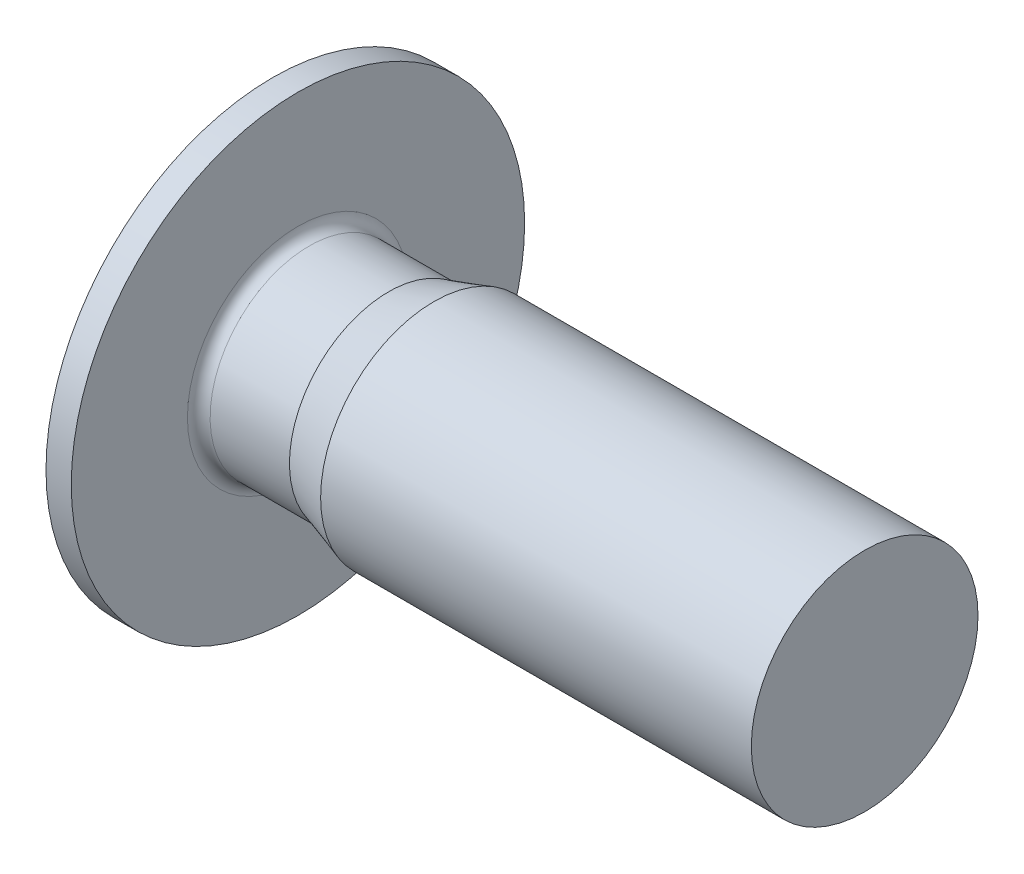
ISO-10303-21;
HEADER;
FILE_DESCRIPTION(('STEP AP214'),'2;1');
FILE_NAME('part.step','',(''),(''),'','','');
FILE_SCHEMA(('AUTOMOTIVE_DESIGN { 1 0 10303 214 1 1 1 1 }'));
ENDSEC;
DATA;
#1=APPLICATION_CONTEXT('core data for automotive mechanical design processes');
#2=APPLICATION_PROTOCOL_DEFINITION('international standard','automotive_design',2000,#1);
#3=PRODUCT_CONTEXT('',#1,'mechanical');
#4=PRODUCT('Part','Part','',(#3));
#5=PRODUCT_RELATED_PRODUCT_CATEGORY('part','',(#4));
#6=PRODUCT_DEFINITION_FORMATION('','',#4);
#7=PRODUCT_DEFINITION_CONTEXT('part definition',#1,'design');
#8=PRODUCT_DEFINITION('design','',#6,#7);
#9=PRODUCT_DEFINITION_SHAPE('','',#8);
#10=(LENGTH_UNIT() NAMED_UNIT(*) SI_UNIT(.MILLI.,.METRE.));
#11=(NAMED_UNIT(*) PLANE_ANGLE_UNIT() SI_UNIT($,.RADIAN.));
#12=(NAMED_UNIT(*) SI_UNIT($,.STERADIAN.) SOLID_ANGLE_UNIT());
#13=UNCERTAINTY_MEASURE_WITH_UNIT(LENGTH_MEASURE(1.E-05),#10,'distance_accuracy_value','');
#14=(GEOMETRIC_REPRESENTATION_CONTEXT(3) GLOBAL_UNCERTAINTY_ASSIGNED_CONTEXT((#13)) GLOBAL_UNIT_ASSIGNED_CONTEXT((#10,
#11,#12)) REPRESENTATION_CONTEXT('',''));
#15=CARTESIAN_POINT('',(0.,0.,0.));
#16=DIRECTION('',(0.,0.,1.));
#17=DIRECTION('',(1.,0.,0.));
#18=AXIS2_PLACEMENT_3D('',#15,#16,#17);
#19=CARTESIAN_POINT('',(0.7,0.,0.));
#20=DIRECTION('',(-1.,0.,0.));
#21=DIRECTION('',(0.,0.,1.));
#22=AXIS2_PLACEMENT_3D('',#19,#20,#21);
#23=PLANE('',#22);
#24=CARTESIAN_POINT('',(0.7,0.,0.));
#25=DIRECTION('',(-1.,0.,0.));
#26=DIRECTION('',(0.,-1.,0.));
#27=AXIS2_PLACEMENT_3D('',#24,#25,#26);
#28=CIRCLE('',#27,0.65);
#29=CARTESIAN_POINT('',(0.7,-0.562916512459885,0.325));
#30=VERTEX_POINT('',#29);
#31=CARTESIAN_POINT('',(0.7,0.,0.65));
#32=VERTEX_POINT('',#31);
#33=EDGE_CURVE('E55',#30,#32,#28,.T.);
#34=ORIENTED_EDGE('',*,*,#33,.F.);
#35=DIRECTION('',(0.,0.5,0.866025403784439));
#36=VECTOR('',#35,1.);
#37=CARTESIAN_POINT('',(0.7,-0.750555349946514,0.));
#38=LINE('',#37,#36);
#39=CARTESIAN_POINT('',(0.7,-0.375277674973257,0.65));
#40=VERTEX_POINT('',#39);
#41=EDGE_CURVE('E270',#30,#40,#38,.T.);
#42=ORIENTED_EDGE('',*,*,#41,.T.);
#43=DIRECTION('',(0.,1.,0.));
#44=VECTOR('',#43,1.);
#45=CARTESIAN_POINT('',(0.7,-0.375277674973257,0.65));
#46=LINE('',#45,#44);
#47=EDGE_CURVE('E238',#40,#32,#46,.T.);
#48=ORIENTED_EDGE('',*,*,#47,.T.);
#49=EDGE_LOOP('',(#34,#42,#48));
#50=FACE_BOUND('',#49,.T.);
#51=ADVANCED_FACE('F44',(#50),#23,.T.);
#52=CARTESIAN_POINT('',(0.7,0.562916512459885,0.325));
#53=VERTEX_POINT('',#52);
#54=EDGE_CURVE('E11',#32,#53,#28,.T.);
#55=ORIENTED_EDGE('',*,*,#54,.F.);
#56=CARTESIAN_POINT('',(0.7,0.375277674973257,0.65));
#57=VERTEX_POINT('',#56);
#58=EDGE_CURVE('E263',#32,#57,#46,.T.);
#59=ORIENTED_EDGE('',*,*,#58,.T.);
#60=DIRECTION('',(0.,0.5,-0.866025403784438));
#61=VECTOR('',#60,1.);
#62=CARTESIAN_POINT('',(0.7,0.375277674973257,0.65));
#63=LINE('',#62,#61);
#64=EDGE_CURVE('E284',#57,#53,#63,.T.);
#65=ORIENTED_EDGE('',*,*,#64,.T.);
#66=EDGE_LOOP('',(#55,#59,#65));
#67=FACE_BOUND('',#66,.T.);
#68=ADVANCED_FACE('F131',(#67),#23,.T.);
#69=CARTESIAN_POINT('',(0.7,0.562916512459885,-0.325));
#70=VERTEX_POINT('',#69);
#71=EDGE_CURVE('E53',#53,#70,#28,.T.);
#72=ORIENTED_EDGE('',*,*,#71,.F.);
#73=CARTESIAN_POINT('',(0.7,0.750555349946514,0.));
#74=VERTEX_POINT('',#73);
#75=EDGE_CURVE('E251',#53,#74,#63,.T.);
#76=ORIENTED_EDGE('',*,*,#75,.T.);
#77=DIRECTION('',(0.,-0.5,-0.866025403784439));
#78=VECTOR('',#77,1.);
#79=CARTESIAN_POINT('',(0.7,0.750555349946514,0.));
#80=LINE('',#79,#78);
#81=EDGE_CURVE('E281',#74,#70,#80,.T.);
#82=ORIENTED_EDGE('',*,*,#81,.T.);
#83=EDGE_LOOP('',(#72,#76,#82));
#84=FACE_BOUND('',#83,.T.);
#85=ADVANCED_FACE('F136',(#84),#23,.T.);
#86=CARTESIAN_POINT('',(0.7,0.,-0.65));
#87=VERTEX_POINT('',#86);
#88=EDGE_CURVE('E229',#70,#87,#28,.T.);
#89=ORIENTED_EDGE('',*,*,#88,.F.);
#90=CARTESIAN_POINT('',(0.7,0.375277674973257,-0.65));
#91=VERTEX_POINT('',#90);
#92=EDGE_CURVE('E283',#70,#91,#80,.T.);
#93=ORIENTED_EDGE('',*,*,#92,.T.);
#94=DIRECTION('',(0.,-1.,0.));
#95=VECTOR('',#94,1.);
#96=CARTESIAN_POINT('',(0.7,0.375277674973257,-0.65));
#97=LINE('',#96,#95);
#98=EDGE_CURVE('E277',#91,#87,#97,.T.);
#99=ORIENTED_EDGE('',*,*,#98,.T.);
#100=EDGE_LOOP('',(#89,#93,#99));
#101=FACE_BOUND('',#100,.T.);
#102=ADVANCED_FACE('F195',(#101),#23,.T.);
#103=CARTESIAN_POINT('',(0.7,-0.562916512459885,-0.325));
#104=VERTEX_POINT('',#103);
#105=EDGE_CURVE('E62',#87,#104,#28,.T.);
#106=ORIENTED_EDGE('',*,*,#105,.F.);
#107=CARTESIAN_POINT('',(0.7,-0.375277674973257,-0.65));
#108=VERTEX_POINT('',#107);
#109=EDGE_CURVE('E280',#87,#108,#97,.T.);
#110=ORIENTED_EDGE('',*,*,#109,.T.);
#111=DIRECTION('',(0.,-0.5,0.866025403784439));
#112=VECTOR('',#111,1.);
#113=CARTESIAN_POINT('',(0.7,-0.375277674973257,-0.65));
#114=LINE('',#113,#112);
#115=EDGE_CURVE('E272',#108,#104,#114,.T.);
#116=ORIENTED_EDGE('',*,*,#115,.T.);
#117=EDGE_LOOP('',(#106,#110,#116));
#118=FACE_BOUND('',#117,.T.);
#119=ADVANCED_FACE('F129',(#118),#23,.T.);
#120=CARTESIAN_POINT('',(-0.5,0.,0.));
#121=DIRECTION('',(-1.,0.,0.));
#122=DIRECTION('',(0.,-1.,0.));
#123=AXIS2_PLACEMENT_3D('',#120,#121,#122);
#124=CYLINDRICAL_SURFACE('',#123,0.875);
#125=CARTESIAN_POINT('',(0.1,0.,0.));
#126=DIRECTION('',(-1.,0.,0.));
#127=DIRECTION('',(0.,-1.,0.));
#128=AXIS2_PLACEMENT_3D('',#125,#126,#127);
#129=CIRCLE('',#128,0.875);
#130=CARTESIAN_POINT('',(0.1,-0.875,0.));
#131=VERTEX_POINT('',#130);
#132=EDGE_CURVE('E48',#131,#131,#129,.F.);
#133=ORIENTED_EDGE('',*,*,#132,.T.);
#134=EDGE_LOOP('',(#133));
#135=FACE_BOUND('',#134,.T.);
#136=CARTESIAN_POINT('',(0.8,0.,0.));
#137=DIRECTION('',(-1.,0.,0.));
#138=DIRECTION('',(0.,-1.,0.));
#139=AXIS2_PLACEMENT_3D('',#136,#137,#138);
#140=CIRCLE('',#139,0.875);
#141=CARTESIAN_POINT('',(0.8,-0.875,0.));
#142=VERTEX_POINT('',#141);
#143=EDGE_CURVE('E202',#142,#142,#140,.T.);
#144=ORIENTED_EDGE('',*,*,#143,.T.);
#145=EDGE_LOOP('',(#144));
#146=FACE_BOUND('',#145,.T.);
#147=ADVANCED_FACE('F188',(#135,#146),#124,.T.);
#148=CARTESIAN_POINT('',(0.,2.,0.));
#149=DIRECTION('',(-1.,0.,0.));
#150=DIRECTION('',(0.,-1.,0.));
#151=AXIS2_PLACEMENT_3D('',#148,#149,#150);
#152=PLANE('',#151);
#153=CARTESIAN_POINT('',(0.,0.,0.));
#154=DIRECTION('',(-1.,0.,0.));
#155=DIRECTION('',(0.,-1.,0.));
#156=AXIS2_PLACEMENT_3D('',#153,#154,#155);
#157=CIRCLE('',#156,0.975);
#158=CARTESIAN_POINT('',(0.,-0.975,0.));
#159=VERTEX_POINT('',#158);
#160=EDGE_CURVE('E225',#159,#159,#157,.T.);
#161=ORIENTED_EDGE('',*,*,#160,.T.);
#162=EDGE_LOOP('',(#161));
#163=FACE_BOUND('',#162,.T.);
#164=CARTESIAN_POINT('',(0.,0.,0.));
#165=DIRECTION('',(-1.,0.,0.));
#166=DIRECTION('',(0.,-1.,0.));
#167=AXIS2_PLACEMENT_3D('',#164,#165,#166);
#168=CIRCLE('',#167,2.);
#169=CARTESIAN_POINT('',(0.,-2.,0.));
#170=VERTEX_POINT('',#169);
#171=EDGE_CURVE('E223',#170,#170,#168,.T.);
#172=ORIENTED_EDGE('',*,*,#171,.F.);
#173=EDGE_LOOP('',(#172));
#174=FACE_BOUND('',#173,.T.);
#175=ADVANCED_FACE('F185',(#163,#174),#152,.F.);
#176=CARTESIAN_POINT('',(-0.5,0.,0.));
#177=DIRECTION('',(-1.,0.,0.));
#178=DIRECTION('',(0.,-1.,0.));
#179=AXIS2_PLACEMENT_3D('',#176,#177,#178);
#180=CYLINDRICAL_SURFACE('',#179,2.);
#181=CARTESIAN_POINT('',(-0.222871870788983,0.,0.));
#182=DIRECTION('',(-1.,0.,0.));
#183=DIRECTION('',(0.,-1.,0.));
#184=AXIS2_PLACEMENT_3D('',#181,#182,#183);
#185=CIRCLE('',#184,2.);
#186=CARTESIAN_POINT('',(-0.222871870788983,-2.,0.));
#187=VERTEX_POINT('',#186);
#188=EDGE_CURVE('E220',#187,#187,#185,.T.);
#189=ORIENTED_EDGE('',*,*,#188,.F.);
#190=EDGE_LOOP('',(#189));
#191=FACE_BOUND('',#190,.T.);
#192=ORIENTED_EDGE('',*,*,#171,.T.);
#193=EDGE_LOOP('',(#192));
#194=FACE_BOUND('',#193,.T.);
#195=ADVANCED_FACE('F181',(#191,#194),#180,.T.);
#196=CARTESIAN_POINT('',(-0.222871870788983,0.,0.));
#197=DIRECTION('',(1.,0.,0.));
#198=DIRECTION('',(0.,1.,0.));
#199=AXIS2_PLACEMENT_3D('',#196,#197,#198);
#200=CONICAL_SURFACE('',#199,2.,1.0471975511966);
#201=CARTESIAN_POINT('',(-0.5,0.,0.));
#202=DIRECTION('',(-1.,0.,0.));
#203=DIRECTION('',(0.,-1.,0.));
#204=AXIS2_PLACEMENT_3D('',#201,#202,#203);
#205=CIRCLE('',#204,1.52);
#206=CARTESIAN_POINT('',(-0.5,-1.52,0.));
#207=VERTEX_POINT('',#206);
#208=EDGE_CURVE('E217',#207,#207,#205,.T.);
#209=ORIENTED_EDGE('',*,*,#208,.F.);
#210=EDGE_LOOP('',(#209));
#211=FACE_BOUND('',#210,.T.);
#212=ORIENTED_EDGE('',*,*,#188,.T.);
#213=EDGE_LOOP('',(#212));
#214=FACE_BOUND('',#213,.T.);
#215=ADVANCED_FACE('F177',(#211,#214),#200,.T.);
#216=CARTESIAN_POINT('',(-0.5,0.,0.));
#217=DIRECTION('',(1.,0.,0.));
#218=DIRECTION('',(0.,1.,0.));
#219=AXIS2_PLACEMENT_3D('',#216,#217,#218);
#220=PLANE('',#219);
#221=DIRECTION('',(0.,-0.5,-0.866025403784439));
#222=VECTOR('',#221,1.);
#223=CARTESIAN_POINT('',(-0.5,0.750555349946514,0.));
#224=LINE('',#223,#222);
#225=CARTESIAN_POINT('',(-0.5,0.750555349946514,0.));
#226=VERTEX_POINT('',#225);
#227=CARTESIAN_POINT('',(-0.5,0.375277674973257,-0.65));
#228=VERTEX_POINT('',#227);
#229=EDGE_CURVE('E232',#226,#228,#224,.T.);
#230=ORIENTED_EDGE('',*,*,#229,.F.);
#231=DIRECTION('',(0.,0.5,-0.866025403784438));
#232=VECTOR('',#231,1.);
#233=CARTESIAN_POINT('',(-0.5,0.375277674973257,0.65));
#234=LINE('',#233,#232);
#235=CARTESIAN_POINT('',(-0.5,0.375277674973257,0.65));
#236=VERTEX_POINT('',#235);
#237=EDGE_CURVE('E70',#236,#226,#234,.T.);
#238=ORIENTED_EDGE('',*,*,#237,.F.);
#239=DIRECTION('',(0.,1.,0.));
#240=VECTOR('',#239,1.);
#241=CARTESIAN_POINT('',(-0.5,-0.375277674973257,0.65));
#242=LINE('',#241,#240);
#243=CARTESIAN_POINT('',(-0.5,-0.375277674973257,0.65));
#244=VERTEX_POINT('',#243);
#245=EDGE_CURVE('E249',#244,#236,#242,.T.);
#246=ORIENTED_EDGE('',*,*,#245,.F.);
#247=DIRECTION('',(0.,0.5,0.866025403784439));
#248=VECTOR('',#247,1.);
#249=CARTESIAN_POINT('',(-0.5,-0.750555349946514,0.));
#250=LINE('',#249,#248);
#251=CARTESIAN_POINT('',(-0.5,-0.750555349946514,0.));
#252=VERTEX_POINT('',#251);
#253=EDGE_CURVE('E246',#252,#244,#250,.T.);
#254=ORIENTED_EDGE('',*,*,#253,.F.);
#255=DIRECTION('',(0.,-0.5,0.866025403784439));
#256=VECTOR('',#255,1.);
#257=CARTESIAN_POINT('',(-0.5,-0.375277674973257,-0.65));
#258=LINE('',#257,#256);
#259=CARTESIAN_POINT('',(-0.5,-0.375277674973257,-0.65));
#260=VERTEX_POINT('',#259);
#261=EDGE_CURVE('E243',#260,#252,#258,.T.);
#262=ORIENTED_EDGE('',*,*,#261,.F.);
#263=DIRECTION('',(0.,-1.,0.));
#264=VECTOR('',#263,1.);
#265=CARTESIAN_POINT('',(-0.5,0.375277674973257,-0.65));
#266=LINE('',#265,#264);
#267=EDGE_CURVE('E235',#228,#260,#266,.T.);
#268=ORIENTED_EDGE('',*,*,#267,.F.);
#269=EDGE_LOOP('',(#230,#238,#246,#254,#262,#268));
#270=FACE_BOUND('',#269,.T.);
#271=ORIENTED_EDGE('',*,*,#208,.T.);
#272=EDGE_LOOP('',(#271));
#273=FACE_BOUND('',#272,.T.);
#274=ADVANCED_FACE('F173',(#270,#273),#220,.F.);
#275=CARTESIAN_POINT('',(5.,1.,0.));
#276=DIRECTION('',(-1.,0.,0.));
#277=DIRECTION('',(0.,-1.,0.));
#278=AXIS2_PLACEMENT_3D('',#275,#276,#277);
#279=PLANE('',#278);
#280=CARTESIAN_POINT('',(5.,0.,0.));
#281=DIRECTION('',(-1.,0.,0.));
#282=DIRECTION('',(0.,-1.,0.));
#283=AXIS2_PLACEMENT_3D('',#280,#281,#282);
#284=CIRCLE('',#283,1.);
#285=CARTESIAN_POINT('',(5.,-1.,0.));
#286=VERTEX_POINT('',#285);
#287=EDGE_CURVE('E207',#286,#286,#284,.T.);
#288=ORIENTED_EDGE('',*,*,#287,.F.);
#289=EDGE_LOOP('',(#288));
#290=FACE_BOUND('',#289,.T.);
#291=ADVANCED_FACE('F169',(#290),#279,.F.);
#292=CARTESIAN_POINT('',(-0.5,0.,0.));
#293=DIRECTION('',(-1.,0.,0.));
#294=DIRECTION('',(0.,-1.,0.));
#295=AXIS2_PLACEMENT_3D('',#292,#293,#294);
#296=CYLINDRICAL_SURFACE('',#295,1.);
#297=CARTESIAN_POINT('',(1.2,0.,0.));
#298=DIRECTION('',(-1.,0.,0.));
#299=DIRECTION('',(0.,-1.,0.));
#300=AXIS2_PLACEMENT_3D('',#297,#298,#299);
#301=CIRCLE('',#300,1.);
#302=CARTESIAN_POINT('',(1.2,-1.,0.));
#303=VERTEX_POINT('',#302);
#304=EDGE_CURVE('E203',#303,#303,#301,.T.);
#305=ORIENTED_EDGE('',*,*,#304,.F.);
#306=EDGE_LOOP('',(#305));
#307=FACE_BOUND('',#306,.T.);
#308=ORIENTED_EDGE('',*,*,#287,.T.);
#309=EDGE_LOOP('',(#308));
#310=FACE_BOUND('',#309,.T.);
#311=ADVANCED_FACE('F165',(#307,#310),#296,.T.);
#312=CARTESIAN_POINT('',(1.2,0.,0.));
#313=DIRECTION('',(1.,0.,0.));
#314=DIRECTION('',(0.,1.,0.));
#315=AXIS2_PLACEMENT_3D('',#312,#313,#314);
#316=CONICAL_SURFACE('',#315,1.,0.302884868374972);
#317=ORIENTED_EDGE('',*,*,#143,.F.);
#318=EDGE_LOOP('',(#317));
#319=FACE_BOUND('',#318,.T.);
#320=ORIENTED_EDGE('',*,*,#304,.T.);
#321=EDGE_LOOP('',(#320));
#322=FACE_BOUND('',#321,.T.);
#323=ADVANCED_FACE('F162',(#319,#322),#316,.T.);
#324=CARTESIAN_POINT('',(0.1,0.,0.));
#325=DIRECTION('',(-1.,0.,0.));
#326=DIRECTION('',(0.,-1.,0.));
#327=AXIS2_PLACEMENT_3D('',#324,#325,#326);
#328=TOROIDAL_SURFACE('',#327,0.975,0.1);
#329=ORIENTED_EDGE('',*,*,#132,.F.);
#330=EDGE_LOOP('',(#329));
#331=FACE_BOUND('',#330,.T.);
#332=ORIENTED_EDGE('',*,*,#160,.F.);
#333=EDGE_LOOP('',(#332));
#334=FACE_BOUND('',#333,.T.);
#335=ADVANCED_FACE('F46',(#331,#334),#328,.F.);
#336=CARTESIAN_POINT('',(0.7,0.375277674973257,0.65));
#337=DIRECTION('',(0.,0.866025403784439,0.5));
#338=DIRECTION('',(0.,-0.5,0.866025403784439));
#339=AXIS2_PLACEMENT_3D('',#336,#337,#338);
#340=PLANE('',#339);
#341=ORIENTED_EDGE('',*,*,#237,.T.);
#342=DIRECTION('',(-1.,0.,0.));
#343=VECTOR('',#342,1.);
#344=CARTESIAN_POINT('',(0.7,0.750555349946514,0.));
#345=LINE('',#344,#343);
#346=EDGE_CURVE('E212',#74,#226,#345,.T.);
#347=ORIENTED_EDGE('',*,*,#346,.F.);
#348=ORIENTED_EDGE('',*,*,#75,.F.);
#349=ORIENTED_EDGE('',*,*,#64,.F.);
#350=DIRECTION('',(-1.,0.,0.));
#351=VECTOR('',#350,1.);
#352=CARTESIAN_POINT('',(0.7,0.375277674973257,0.65));
#353=LINE('',#352,#351);
#354=EDGE_CURVE('E204',#57,#236,#353,.T.);
#355=ORIENTED_EDGE('',*,*,#354,.T.);
#356=EDGE_LOOP('',(#341,#347,#348,#349,#355));
#357=FACE_BOUND('',#356,.T.);
#358=ADVANCED_FACE('F144',(#357),#340,.F.);
#359=CARTESIAN_POINT('',(0.7,-0.375277674973257,0.65));
#360=DIRECTION('',(0.,0.,1.));
#361=DIRECTION('',(1.,0.,0.));
#362=AXIS2_PLACEMENT_3D('',#359,#360,#361);
#363=PLANE('',#362);
#364=ORIENTED_EDGE('',*,*,#245,.T.);
#365=ORIENTED_EDGE('',*,*,#354,.F.);
#366=ORIENTED_EDGE('',*,*,#58,.F.);
#367=ORIENTED_EDGE('',*,*,#47,.F.);
#368=DIRECTION('',(-1.,0.,0.));
#369=VECTOR('',#368,1.);
#370=CARTESIAN_POINT('',(0.7,-0.375277674973257,0.65));
#371=LINE('',#370,#369);
#372=EDGE_CURVE('E209',#40,#244,#371,.T.);
#373=ORIENTED_EDGE('',*,*,#372,.T.);
#374=EDGE_LOOP('',(#364,#365,#366,#367,#373));
#375=FACE_BOUND('',#374,.T.);
#376=ADVANCED_FACE('F140',(#375),#363,.F.);
#377=CARTESIAN_POINT('',(0.7,-0.750555349946514,0.));
#378=DIRECTION('',(0.,-0.866025403784439,0.5));
#379=DIRECTION('',(0.,-0.5,-0.866025403784439));
#380=AXIS2_PLACEMENT_3D('',#377,#378,#379);
#381=PLANE('',#380);
#382=ORIENTED_EDGE('',*,*,#253,.T.);
#383=ORIENTED_EDGE('',*,*,#372,.F.);
#384=ORIENTED_EDGE('',*,*,#41,.F.);
#385=CARTESIAN_POINT('',(0.7,-0.750555349946514,0.));
#386=VERTEX_POINT('',#385);
#387=EDGE_CURVE('E265',#386,#30,#38,.T.);
#388=ORIENTED_EDGE('',*,*,#387,.F.);
#389=DIRECTION('',(-1.,0.,0.));
#390=VECTOR('',#389,1.);
#391=CARTESIAN_POINT('',(0.7,-0.750555349946514,0.));
#392=LINE('',#391,#390);
#393=EDGE_CURVE('E254',#386,#252,#392,.T.);
#394=ORIENTED_EDGE('',*,*,#393,.T.);
#395=EDGE_LOOP('',(#382,#383,#384,#388,#394));
#396=FACE_BOUND('',#395,.T.);
#397=ADVANCED_FACE('F143',(#396),#381,.F.);
#398=CARTESIAN_POINT('',(0.7,-0.375277674973257,-0.65));
#399=DIRECTION('',(0.,-0.866025403784439,-0.5));
#400=DIRECTION('',(0.,0.5,-0.866025403784439));
#401=AXIS2_PLACEMENT_3D('',#398,#399,#400);
#402=PLANE('',#401);
#403=ORIENTED_EDGE('',*,*,#261,.T.);
#404=ORIENTED_EDGE('',*,*,#393,.F.);
#405=EDGE_CURVE('E276',#104,#386,#114,.T.);
#406=ORIENTED_EDGE('',*,*,#405,.F.);
#407=ORIENTED_EDGE('',*,*,#115,.F.);
#408=DIRECTION('',(-1.,0.,0.));
#409=VECTOR('',#408,1.);
#410=CARTESIAN_POINT('',(0.7,-0.375277674973257,-0.65));
#411=LINE('',#410,#409);
#412=EDGE_CURVE('E256',#108,#260,#411,.T.);
#413=ORIENTED_EDGE('',*,*,#412,.T.);
#414=EDGE_LOOP('',(#403,#404,#406,#407,#413));
#415=FACE_BOUND('',#414,.T.);
#416=ADVANCED_FACE('F148',(#415),#402,.F.);
#417=CARTESIAN_POINT('',(0.7,0.375277674973257,-0.65));
#418=DIRECTION('',(0.,0.,-1.));
#419=DIRECTION('',(0.,1.,0.));
#420=AXIS2_PLACEMENT_3D('',#417,#418,#419);
#421=PLANE('',#420);
#422=ORIENTED_EDGE('',*,*,#267,.T.);
#423=ORIENTED_EDGE('',*,*,#412,.F.);
#424=ORIENTED_EDGE('',*,*,#109,.F.);
#425=ORIENTED_EDGE('',*,*,#98,.F.);
#426=DIRECTION('',(-1.,0.,0.));
#427=VECTOR('',#426,1.);
#428=CARTESIAN_POINT('',(0.7,0.375277674973257,-0.65));
#429=LINE('',#428,#427);
#430=EDGE_CURVE('E257',#91,#228,#429,.T.);
#431=ORIENTED_EDGE('',*,*,#430,.T.);
#432=EDGE_LOOP('',(#422,#423,#424,#425,#431));
#433=FACE_BOUND('',#432,.T.);
#434=ADVANCED_FACE('F152',(#433),#421,.F.);
#435=CARTESIAN_POINT('',(0.7,0.750555349946514,0.));
#436=DIRECTION('',(0.,0.866025403784439,-0.5));
#437=DIRECTION('',(0.,0.5,0.866025403784439));
#438=AXIS2_PLACEMENT_3D('',#435,#436,#437);
#439=PLANE('',#438);
#440=ORIENTED_EDGE('',*,*,#229,.T.);
#441=ORIENTED_EDGE('',*,*,#430,.F.);
#442=ORIENTED_EDGE('',*,*,#92,.F.);
#443=ORIENTED_EDGE('',*,*,#81,.F.);
#444=ORIENTED_EDGE('',*,*,#346,.T.);
#445=EDGE_LOOP('',(#440,#441,#442,#443,#444));
#446=FACE_BOUND('',#445,.T.);
#447=ADVANCED_FACE('F126',(#446),#439,.F.);
#448=EDGE_CURVE('E228',#104,#30,#28,.T.);
#449=ORIENTED_EDGE('',*,*,#448,.F.);
#450=ORIENTED_EDGE('',*,*,#405,.T.);
#451=ORIENTED_EDGE('',*,*,#387,.T.);
#452=EDGE_LOOP('',(#449,#450,#451));
#453=FACE_BOUND('',#452,.T.);
#454=ADVANCED_FACE('F121',(#453),#23,.T.);
#455=CARTESIAN_POINT('',(1.09055940236791,0.,0.));
#456=DIRECTION('',(-1.,0.,0.));
#457=DIRECTION('',(0.,-1.,0.));
#458=AXIS2_PLACEMENT_3D('',#455,#456,#457);
#459=CONICAL_SURFACE('',#458,0.,1.02974425867666);
#460=ORIENTED_EDGE('',*,*,#33,.T.);
#461=ORIENTED_EDGE('',*,*,#54,.T.);
#462=ORIENTED_EDGE('',*,*,#71,.T.);
#463=ORIENTED_EDGE('',*,*,#88,.T.);
#464=ORIENTED_EDGE('',*,*,#105,.T.);
#465=ORIENTED_EDGE('',*,*,#448,.T.);
#466=EDGE_LOOP('',(#460,#461,#462,#463,#464,#465));
#467=FACE_BOUND('',#466,.T.);
#468=CARTESIAN_POINT('',(1.09055940236791,0.,0.));
#469=VERTEX_POINT('',#468);
#470=VERTEX_LOOP('',#469);
#471=FACE_BOUND('',#470,.T.);
#472=ADVANCED_FACE('F119',(#467,#471),#459,.F.);
#473=CLOSED_SHELL('',(#51,#68,#85,#102,#119,#147,#175,#195,#215,#274,#291,#311,#323,#335,#358,
#376,#397,#416,#434,#447,#454,#472));
#474=MANIFOLD_SOLID_BREP('B2',#473);
#475=ADVANCED_BREP_SHAPE_REPRESENTATION('',(#18,#474),#14);
#476=SHAPE_DEFINITION_REPRESENTATION(#9,#475);
ENDSEC;
END-ISO-10303-21;
